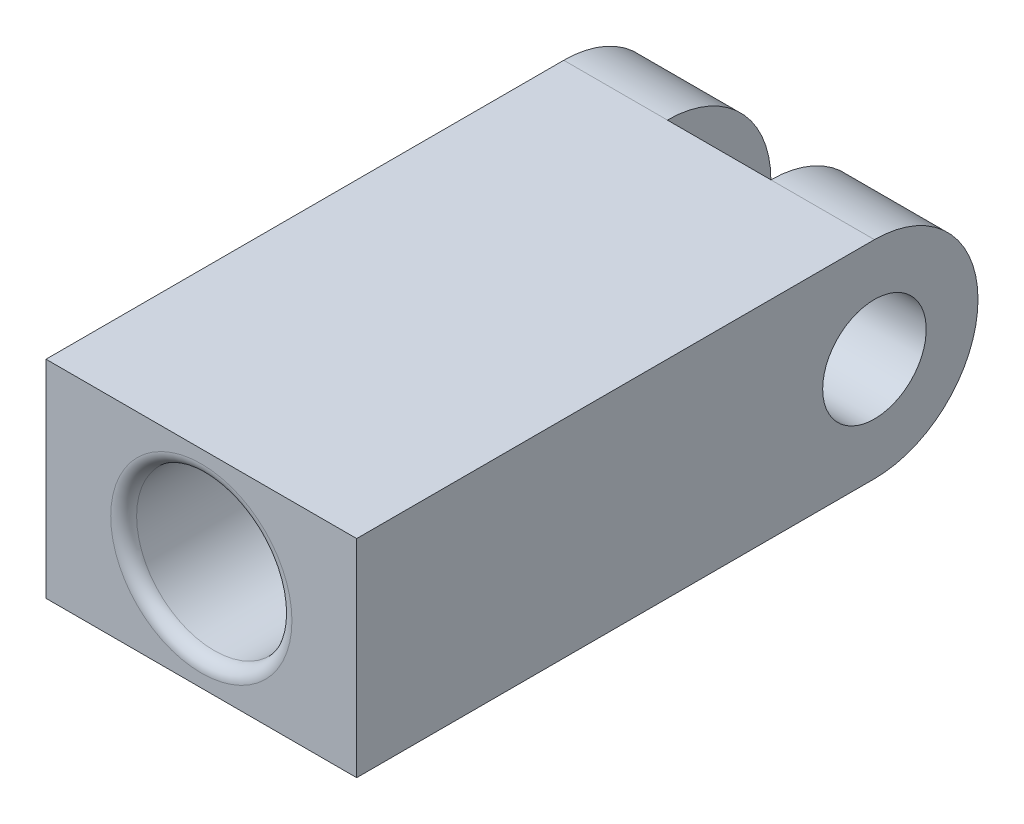
ISO-10303-21;
HEADER;
FILE_DESCRIPTION(('STEP AP214'),'2;1');
FILE_NAME('part.step','',(''),(''),'','','');
FILE_SCHEMA(('AUTOMOTIVE_DESIGN { 1 0 10303 214 1 1 1 1 }'));
ENDSEC;
DATA;
#1=APPLICATION_CONTEXT('core data for automotive mechanical design processes');
#2=APPLICATION_PROTOCOL_DEFINITION('international standard','automotive_design',2000,#1);
#3=PRODUCT_CONTEXT('',#1,'mechanical');
#4=PRODUCT('Part','Part','',(#3));
#5=PRODUCT_RELATED_PRODUCT_CATEGORY('part','',(#4));
#6=PRODUCT_DEFINITION_FORMATION('','',#4);
#7=PRODUCT_DEFINITION_CONTEXT('part definition',#1,'design');
#8=PRODUCT_DEFINITION('design','',#6,#7);
#9=PRODUCT_DEFINITION_SHAPE('','',#8);
#10=(LENGTH_UNIT() NAMED_UNIT(*) SI_UNIT(.MILLI.,.METRE.));
#11=(NAMED_UNIT(*) PLANE_ANGLE_UNIT() SI_UNIT($,.RADIAN.));
#12=(NAMED_UNIT(*) SI_UNIT($,.STERADIAN.) SOLID_ANGLE_UNIT());
#13=UNCERTAINTY_MEASURE_WITH_UNIT(LENGTH_MEASURE(1.E-05),#10,'distance_accuracy_value','');
#14=(GEOMETRIC_REPRESENTATION_CONTEXT(3) GLOBAL_UNCERTAINTY_ASSIGNED_CONTEXT((#13)) GLOBAL_UNIT_ASSIGNED_CONTEXT((#10,
#11,#12)) REPRESENTATION_CONTEXT('',''));
#15=CARTESIAN_POINT('',(0.,0.,0.));
#16=DIRECTION('',(0.,0.,1.));
#17=DIRECTION('',(1.,0.,0.));
#18=AXIS2_PLACEMENT_3D('',#15,#16,#17);
#19=CARTESIAN_POINT('',(50.,5.,0.));
#20=DIRECTION('',(-1.,0.,0.));
#21=DIRECTION('',(0.,0.,1.));
#22=AXIS2_PLACEMENT_3D('',#19,#20,#21);
#23=CYLINDRICAL_SURFACE('',#22,10.);
#24=CARTESIAN_POINT('',(50.,5.,0.));
#25=DIRECTION('',(-1.,0.,0.));
#26=DIRECTION('',(0.,0.,1.));
#27=AXIS2_PLACEMENT_3D('',#24,#25,#26);
#28=CIRCLE('',#27,10.);
#29=CARTESIAN_POINT('',(50.,5.,10.));
#30=VERTEX_POINT('',#29);
#31=EDGE_CURVE('E191',#30,#30,#28,.T.);
#32=ORIENTED_EDGE('',*,*,#31,.F.);
#33=EDGE_LOOP('',(#32));
#34=FACE_BOUND('',#33,.T.);
#35=CARTESIAN_POINT('',(30.,5.,0.));
#36=DIRECTION('',(1.,0.,0.));
#37=DIRECTION('',(0.,0.,-1.));
#38=AXIS2_PLACEMENT_3D('',#35,#36,#37);
#39=CIRCLE('',#38,10.);
#40=CARTESIAN_POINT('',(30.,5.,-10.));
#41=VERTEX_POINT('',#40);
#42=EDGE_CURVE('E183',#41,#41,#39,.T.);
#43=ORIENTED_EDGE('',*,*,#42,.F.);
#44=EDGE_LOOP('',(#43));
#45=FACE_BOUND('',#44,.T.);
#46=ADVANCED_FACE('F39',(#34,#45),#23,.F.);
#47=CARTESIAN_POINT('',(-10.,-15.,100.));
#48=DIRECTION('',(1.,0.,0.));
#49=DIRECTION('',(0.,0.,-1.));
#50=AXIS2_PLACEMENT_3D('',#47,#48,#49);
#51=PLANE('',#50);
#52=CARTESIAN_POINT('',(-10.,5.,0.));
#53=DIRECTION('',(1.,0.,0.));
#54=DIRECTION('',(0.,0.,-1.));
#55=AXIS2_PLACEMENT_3D('',#52,#53,#54);
#56=CIRCLE('',#55,10.);
#57=CARTESIAN_POINT('',(-10.,5.,-10.));
#58=VERTEX_POINT('',#57);
#59=EDGE_CURVE('E180',#58,#58,#56,.T.);
#60=ORIENTED_EDGE('',*,*,#59,.T.);
#61=EDGE_LOOP('',(#60));
#62=FACE_BOUND('',#61,.T.);
#63=DIRECTION('',(0.,0.,-1.));
#64=VECTOR('',#63,1.);
#65=CARTESIAN_POINT('',(-10.,25.,100.));
#66=LINE('',#65,#64);
#67=CARTESIAN_POINT('',(-10.,25.,100.));
#68=VERTEX_POINT('',#67);
#69=CARTESIAN_POINT('',(-10.,25.,0.));
#70=VERTEX_POINT('',#69);
#71=EDGE_CURVE('E111',#68,#70,#66,.T.);
#72=ORIENTED_EDGE('',*,*,#71,.T.);
#73=CARTESIAN_POINT('',(-10.,5.,0.));
#74=DIRECTION('',(-1.,0.,0.));
#75=DIRECTION('',(0.,0.,1.));
#76=AXIS2_PLACEMENT_3D('',#73,#74,#75);
#77=CIRCLE('',#76,20.);
#78=CARTESIAN_POINT('',(-10.,-15.,0.));
#79=VERTEX_POINT('',#78);
#80=EDGE_CURVE('E182',#70,#79,#77,.T.);
#81=ORIENTED_EDGE('',*,*,#80,.T.);
#82=DIRECTION('',(0.,0.,-1.));
#83=VECTOR('',#82,1.);
#84=CARTESIAN_POINT('',(-10.,-15.,100.));
#85=LINE('',#84,#83);
#86=CARTESIAN_POINT('',(-10.,-15.,100.));
#87=VERTEX_POINT('',#86);
#88=EDGE_CURVE('E103',#87,#79,#85,.T.);
#89=ORIENTED_EDGE('',*,*,#88,.F.);
#90=DIRECTION('',(0.,-1.,0.));
#91=VECTOR('',#90,1.);
#92=CARTESIAN_POINT('',(-10.,-15.,100.));
#93=LINE('',#92,#91);
#94=EDGE_CURVE('E91',#68,#87,#93,.T.);
#95=ORIENTED_EDGE('',*,*,#94,.F.);
#96=EDGE_LOOP('',(#72,#81,#89,#95));
#97=FACE_BOUND('',#96,.T.);
#98=ADVANCED_FACE('F152',(#62,#97),#51,.F.);
#99=CARTESIAN_POINT('',(50.,-15.,100.));
#100=DIRECTION('',(0.,1.,0.));
#101=DIRECTION('',(-1.,0.,0.));
#102=AXIS2_PLACEMENT_3D('',#99,#100,#101);
#103=PLANE('',#102);
#104=DIRECTION('',(1.,0.,0.));
#105=VECTOR('',#104,1.);
#106=CARTESIAN_POINT('',(50.,-15.,0.));
#107=LINE('',#106,#105);
#108=CARTESIAN_POINT('',(9.99999999999999,-15.,0.));
#109=VERTEX_POINT('',#108);
#110=EDGE_CURVE('E115',#79,#109,#107,.T.);
#111=ORIENTED_EDGE('',*,*,#110,.T.);
#112=CARTESIAN_POINT('',(30.,-15.,0.));
#113=VERTEX_POINT('',#112);
#114=EDGE_CURVE('E119',#109,#113,#107,.T.);
#115=ORIENTED_EDGE('',*,*,#114,.T.);
#116=CARTESIAN_POINT('',(50.,-15.,0.));
#117=VERTEX_POINT('',#116);
#118=EDGE_CURVE('E101',#113,#117,#107,.T.);
#119=ORIENTED_EDGE('',*,*,#118,.T.);
#120=DIRECTION('',(0.,0.,-1.));
#121=VECTOR('',#120,1.);
#122=CARTESIAN_POINT('',(50.,-15.,100.));
#123=LINE('',#122,#121);
#124=CARTESIAN_POINT('',(50.,-15.,100.));
#125=VERTEX_POINT('',#124);
#126=EDGE_CURVE('E97',#125,#117,#123,.T.);
#127=ORIENTED_EDGE('',*,*,#126,.F.);
#128=DIRECTION('',(1.,0.,0.));
#129=VECTOR('',#128,1.);
#130=CARTESIAN_POINT('',(50.,-15.,100.));
#131=LINE('',#130,#129);
#132=EDGE_CURVE('E85',#87,#125,#131,.T.);
#133=ORIENTED_EDGE('',*,*,#132,.F.);
#134=ORIENTED_EDGE('',*,*,#88,.T.);
#135=EDGE_LOOP('',(#111,#115,#119,#127,#133,#134));
#136=FACE_BOUND('',#135,.T.);
#137=ADVANCED_FACE('F99',(#136),#103,.F.);
#138=CARTESIAN_POINT('',(50.,-15.,100.));
#139=DIRECTION('',(-1.,0.,0.));
#140=DIRECTION('',(0.,0.,1.));
#141=AXIS2_PLACEMENT_3D('',#138,#139,#140);
#142=PLANE('',#141);
#143=ORIENTED_EDGE('',*,*,#31,.T.);
#144=EDGE_LOOP('',(#143));
#145=FACE_BOUND('',#144,.T.);
#146=ORIENTED_EDGE('',*,*,#126,.T.);
#147=CARTESIAN_POINT('',(50.,5.00000000000001,0.));
#148=DIRECTION('',(1.,0.,0.));
#149=DIRECTION('',(0.,0.,-1.));
#150=AXIS2_PLACEMENT_3D('',#147,#148,#149);
#151=CIRCLE('',#150,20.);
#152=CARTESIAN_POINT('',(50.,25.,0.));
#153=VERTEX_POINT('',#152);
#154=EDGE_CURVE('E69',#117,#153,#151,.T.);
#155=ORIENTED_EDGE('',*,*,#154,.T.);
#156=DIRECTION('',(0.,0.,-1.));
#157=VECTOR('',#156,1.);
#158=CARTESIAN_POINT('',(50.,25.,100.));
#159=LINE('',#158,#157);
#160=CARTESIAN_POINT('',(50.,25.,100.));
#161=VERTEX_POINT('',#160);
#162=EDGE_CURVE('E104',#161,#153,#159,.T.);
#163=ORIENTED_EDGE('',*,*,#162,.F.);
#164=DIRECTION('',(0.,1.,0.));
#165=VECTOR('',#164,1.);
#166=CARTESIAN_POINT('',(50.,-15.,100.));
#167=LINE('',#166,#165);
#168=EDGE_CURVE('E89',#125,#161,#167,.T.);
#169=ORIENTED_EDGE('',*,*,#168,.F.);
#170=EDGE_LOOP('',(#146,#155,#163,#169));
#171=FACE_BOUND('',#170,.T.);
#172=ADVANCED_FACE('F106',(#145,#171),#142,.F.);
#173=CARTESIAN_POINT('',(50.,25.,100.));
#174=DIRECTION('',(0.,-1.,0.));
#175=DIRECTION('',(1.,0.,0.));
#176=AXIS2_PLACEMENT_3D('',#173,#174,#175);
#177=PLANE('',#176);
#178=DIRECTION('',(-1.,0.,0.));
#179=VECTOR('',#178,1.);
#180=CARTESIAN_POINT('',(50.,25.,0.));
#181=LINE('',#180,#179);
#182=CARTESIAN_POINT('',(30.,25.,0.));
#183=VERTEX_POINT('',#182);
#184=EDGE_CURVE('E120',#153,#183,#181,.T.);
#185=ORIENTED_EDGE('',*,*,#184,.T.);
#186=CARTESIAN_POINT('',(9.99999999999999,25.,0.));
#187=VERTEX_POINT('',#186);
#188=EDGE_CURVE('E124',#183,#187,#181,.T.);
#189=ORIENTED_EDGE('',*,*,#188,.T.);
#190=EDGE_CURVE('E118',#187,#70,#181,.T.);
#191=ORIENTED_EDGE('',*,*,#190,.T.);
#192=ORIENTED_EDGE('',*,*,#71,.F.);
#193=DIRECTION('',(-1.,0.,0.));
#194=VECTOR('',#193,1.);
#195=CARTESIAN_POINT('',(50.,25.,100.));
#196=LINE('',#195,#194);
#197=EDGE_CURVE('E57',#161,#68,#196,.T.);
#198=ORIENTED_EDGE('',*,*,#197,.F.);
#199=ORIENTED_EDGE('',*,*,#162,.T.);
#200=EDGE_LOOP('',(#185,#189,#191,#192,#198,#199));
#201=FACE_BOUND('',#200,.T.);
#202=ADVANCED_FACE('F240',(#201),#177,.F.);
#203=CARTESIAN_POINT('',(0.,0.,100.));
#204=DIRECTION('',(0.,0.,1.));
#205=DIRECTION('',(1.,0.,0.));
#206=AXIS2_PLACEMENT_3D('',#203,#204,#205);
#207=PLANE('',#206);
#208=CARTESIAN_POINT('',(20.,5.,100.));
#209=DIRECTION('',(0.,0.,1.));
#210=DIRECTION('',(1.,0.,0.));
#211=AXIS2_PLACEMENT_3D('',#208,#209,#210);
#212=CIRCLE('',#211,17.5);
#213=CARTESIAN_POINT('',(37.5,5.,100.));
#214=VERTEX_POINT('',#213);
#215=EDGE_CURVE('E11',#214,#214,#212,.F.);
#216=ORIENTED_EDGE('',*,*,#215,.T.);
#217=EDGE_LOOP('',(#216));
#218=FACE_BOUND('',#217,.T.);
#219=ORIENTED_EDGE('',*,*,#94,.T.);
#220=ORIENTED_EDGE('',*,*,#132,.T.);
#221=ORIENTED_EDGE('',*,*,#168,.T.);
#222=ORIENTED_EDGE('',*,*,#197,.T.);
#223=EDGE_LOOP('',(#219,#220,#221,#222));
#224=FACE_BOUND('',#223,.T.);
#225=ADVANCED_FACE('F87',(#218,#224),#207,.T.);
#226=CARTESIAN_POINT('',(30.,5.00000000000001,0.));
#227=DIRECTION('',(1.,0.,0.));
#228=DIRECTION('',(0.,0.,-1.));
#229=AXIS2_PLACEMENT_3D('',#226,#227,#228);
#230=CYLINDRICAL_SURFACE('',#229,20.);
#231=ORIENTED_EDGE('',*,*,#118,.F.);
#232=CARTESIAN_POINT('',(30.,5.00000000000001,0.));
#233=DIRECTION('',(1.,0.,0.));
#234=DIRECTION('',(0.,0.,-1.));
#235=AXIS2_PLACEMENT_3D('',#232,#233,#234);
#236=CIRCLE('',#235,20.);
#237=EDGE_CURVE('E198',#113,#183,#236,.T.);
#238=ORIENTED_EDGE('',*,*,#237,.T.);
#239=ORIENTED_EDGE('',*,*,#184,.F.);
#240=ORIENTED_EDGE('',*,*,#154,.F.);
#241=EDGE_LOOP('',(#231,#238,#239,#240));
#242=FACE_BOUND('',#241,.T.);
#243=ADVANCED_FACE('F219',(#242),#230,.T.);
#244=CARTESIAN_POINT('',(30.,5.00000000000001,0.));
#245=DIRECTION('',(1.,0.,0.));
#246=DIRECTION('',(0.,0.,-1.));
#247=AXIS2_PLACEMENT_3D('',#244,#245,#246);
#248=PLANE('',#247);
#249=CARTESIAN_POINT('',(30.,5.,0.));
#250=DIRECTION('',(-1.,0.,0.));
#251=DIRECTION('',(0.,0.,1.));
#252=AXIS2_PLACEMENT_3D('',#249,#250,#251);
#253=CIRCLE('',#252,20.);
#254=EDGE_CURVE('E224',#113,#183,#253,.T.);
#255=ORIENTED_EDGE('',*,*,#254,.T.);
#256=ORIENTED_EDGE('',*,*,#237,.F.);
#257=EDGE_LOOP('',(#255,#256));
#258=FACE_BOUND('',#257,.T.);
#259=ORIENTED_EDGE('',*,*,#42,.T.);
#260=EDGE_LOOP('',(#259));
#261=FACE_BOUND('',#260,.T.);
#262=ADVANCED_FACE('F222',(#258,#261),#248,.F.);
#263=CARTESIAN_POINT('',(10.,5.,0.));
#264=DIRECTION('',(-1.,0.,0.));
#265=DIRECTION('',(0.,0.,1.));
#266=AXIS2_PLACEMENT_3D('',#263,#264,#265);
#267=PLANE('',#266);
#268=CARTESIAN_POINT('',(10.,5.,0.));
#269=DIRECTION('',(-1.,0.,0.));
#270=DIRECTION('',(0.,0.,1.));
#271=AXIS2_PLACEMENT_3D('',#268,#269,#270);
#272=CIRCLE('',#271,10.);
#273=CARTESIAN_POINT('',(10.,5.,10.));
#274=VERTEX_POINT('',#273);
#275=EDGE_CURVE('E132',#274,#274,#272,.T.);
#276=ORIENTED_EDGE('',*,*,#275,.T.);
#277=EDGE_LOOP('',(#276));
#278=FACE_BOUND('',#277,.T.);
#279=CARTESIAN_POINT('',(10.,5.,0.));
#280=DIRECTION('',(-1.,0.,0.));
#281=DIRECTION('',(0.,0.,1.));
#282=AXIS2_PLACEMENT_3D('',#279,#280,#281);
#283=CIRCLE('',#282,20.);
#284=EDGE_CURVE('E188',#187,#109,#283,.T.);
#285=ORIENTED_EDGE('',*,*,#284,.F.);
#286=CARTESIAN_POINT('',(9.99999999999999,5.,0.));
#287=DIRECTION('',(-1.,0.,0.));
#288=DIRECTION('',(0.,0.,1.));
#289=AXIS2_PLACEMENT_3D('',#286,#287,#288);
#290=CIRCLE('',#289,20.);
#291=EDGE_CURVE('E228',#109,#187,#290,.T.);
#292=ORIENTED_EDGE('',*,*,#291,.F.);
#293=EDGE_LOOP('',(#285,#292));
#294=FACE_BOUND('',#293,.T.);
#295=ADVANCED_FACE('F173',(#278,#294),#267,.F.);
#296=CARTESIAN_POINT('',(10.,5.,0.));
#297=DIRECTION('',(-1.,0.,0.));
#298=DIRECTION('',(0.,0.,1.));
#299=AXIS2_PLACEMENT_3D('',#296,#297,#298);
#300=CYLINDRICAL_SURFACE('',#299,20.);
#301=ORIENTED_EDGE('',*,*,#284,.T.);
#302=ORIENTED_EDGE('',*,*,#110,.F.);
#303=ORIENTED_EDGE('',*,*,#80,.F.);
#304=ORIENTED_EDGE('',*,*,#190,.F.);
#305=EDGE_LOOP('',(#301,#302,#303,#304));
#306=FACE_BOUND('',#305,.T.);
#307=ADVANCED_FACE('F166',(#306),#300,.T.);
#308=ORIENTED_EDGE('',*,*,#275,.F.);
#309=EDGE_LOOP('',(#308));
#310=FACE_BOUND('',#309,.T.);
#311=ORIENTED_EDGE('',*,*,#59,.F.);
#312=EDGE_LOOP('',(#311));
#313=FACE_BOUND('',#312,.T.);
#314=ADVANCED_FACE('F155',(#310,#313),#23,.F.);
#315=CARTESIAN_POINT('',(9.99999999999999,5.,0.));
#316=DIRECTION('',(1.,0.,0.));
#317=DIRECTION('',(0.,0.,-1.));
#318=AXIS2_PLACEMENT_3D('',#315,#316,#317);
#319=CYLINDRICAL_SURFACE('',#318,20.);
#320=ORIENTED_EDGE('',*,*,#114,.F.);
#321=ORIENTED_EDGE('',*,*,#291,.T.);
#322=ORIENTED_EDGE('',*,*,#188,.F.);
#323=ORIENTED_EDGE('',*,*,#254,.F.);
#324=EDGE_LOOP('',(#320,#321,#322,#323));
#325=FACE_BOUND('',#324,.T.);
#326=ADVANCED_FACE('F165',(#325),#319,.F.);
#327=CARTESIAN_POINT('',(20.,5.,70.));
#328=DIRECTION('',(0.,0.,1.));
#329=DIRECTION('',(1.,0.,0.));
#330=AXIS2_PLACEMENT_3D('',#327,#328,#329);
#331=CYLINDRICAL_SURFACE('',#330,15.);
#332=CARTESIAN_POINT('',(20.,5.,97.5));
#333=DIRECTION('',(0.,0.,1.));
#334=DIRECTION('',(1.,0.,0.));
#335=AXIS2_PLACEMENT_3D('',#332,#333,#334);
#336=CIRCLE('',#335,15.);
#337=CARTESIAN_POINT('',(35.,5.,97.5));
#338=VERTEX_POINT('',#337);
#339=EDGE_CURVE('E49',#338,#338,#336,.T.);
#340=ORIENTED_EDGE('',*,*,#339,.T.);
#341=EDGE_LOOP('',(#340));
#342=FACE_BOUND('',#341,.T.);
#343=CARTESIAN_POINT('',(20.,5.,70.));
#344=DIRECTION('',(0.,0.,1.));
#345=DIRECTION('',(1.,0.,0.));
#346=AXIS2_PLACEMENT_3D('',#343,#344,#345);
#347=CIRCLE('',#346,15.);
#348=CARTESIAN_POINT('',(35.,5.,70.));
#349=VERTEX_POINT('',#348);
#350=EDGE_CURVE('E229',#349,#349,#347,.T.);
#351=ORIENTED_EDGE('',*,*,#350,.F.);
#352=EDGE_LOOP('',(#351));
#353=FACE_BOUND('',#352,.T.);
#354=ADVANCED_FACE('F139',(#342,#353),#331,.F.);
#355=CARTESIAN_POINT('',(0.,0.,70.));
#356=DIRECTION('',(0.,0.,1.));
#357=DIRECTION('',(1.,0.,0.));
#358=AXIS2_PLACEMENT_3D('',#355,#356,#357);
#359=PLANE('',#358);
#360=ORIENTED_EDGE('',*,*,#350,.T.);
#361=EDGE_LOOP('',(#360));
#362=FACE_BOUND('',#361,.T.);
#363=ADVANCED_FACE('F143',(#362),#359,.T.);
#364=CARTESIAN_POINT('',(20.,5.,97.5));
#365=DIRECTION('',(0.,0.,1.));
#366=DIRECTION('',(1.,0.,0.));
#367=AXIS2_PLACEMENT_3D('',#364,#365,#366);
#368=TOROIDAL_SURFACE('',#367,17.5,2.5);
#369=ORIENTED_EDGE('',*,*,#215,.F.);
#370=EDGE_LOOP('',(#369));
#371=FACE_BOUND('',#370,.T.);
#372=ORIENTED_EDGE('',*,*,#339,.F.);
#373=EDGE_LOOP('',(#372));
#374=FACE_BOUND('',#373,.T.);
#375=ADVANCED_FACE('F41',(#371,#374),#368,.T.);
#376=CLOSED_SHELL('',(#46,#98,#137,#172,#202,#225,#243,#262,#295,#307,#314,#326,#354,#363,#375));
#377=MANIFOLD_SOLID_BREP('B2',#376);
#378=ADVANCED_BREP_SHAPE_REPRESENTATION('',(#18,#377),#14);
#379=SHAPE_DEFINITION_REPRESENTATION(#9,#378);
ENDSEC;
END-ISO-10303-21;
